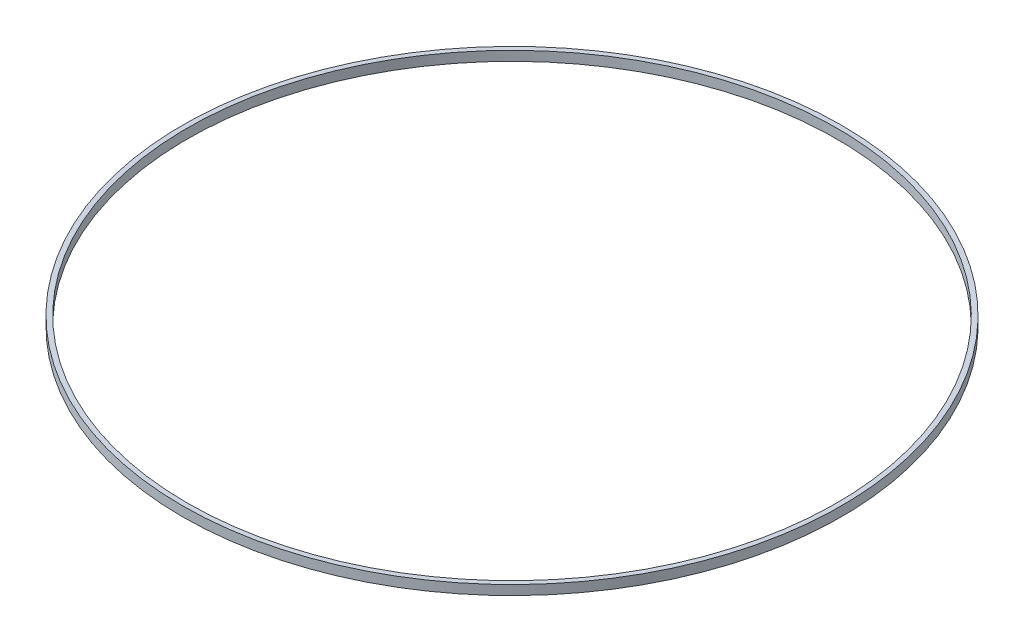
ISO-10303-21;
HEADER;
FILE_DESCRIPTION(('STEP AP214'),'2;1');
FILE_NAME('part.step','',(''),(''),'','','');
FILE_SCHEMA(('AUTOMOTIVE_DESIGN { 1 0 10303 214 1 1 1 1 }'));
ENDSEC;
DATA;
#1=APPLICATION_CONTEXT('core data for automotive mechanical design processes');
#2=APPLICATION_PROTOCOL_DEFINITION('international standard','automotive_design',2000,#1);
#3=PRODUCT_CONTEXT('',#1,'mechanical');
#4=PRODUCT('Part','Part','',(#3));
#5=PRODUCT_RELATED_PRODUCT_CATEGORY('part','',(#4));
#6=PRODUCT_DEFINITION_FORMATION('','',#4);
#7=PRODUCT_DEFINITION_CONTEXT('part definition',#1,'design');
#8=PRODUCT_DEFINITION('design','',#6,#7);
#9=PRODUCT_DEFINITION_SHAPE('','',#8);
#10=(LENGTH_UNIT() NAMED_UNIT(*) SI_UNIT(.MILLI.,.METRE.));
#11=(NAMED_UNIT(*) PLANE_ANGLE_UNIT() SI_UNIT($,.RADIAN.));
#12=(NAMED_UNIT(*) SI_UNIT($,.STERADIAN.) SOLID_ANGLE_UNIT());
#13=UNCERTAINTY_MEASURE_WITH_UNIT(LENGTH_MEASURE(1.E-05),#10,'distance_accuracy_value','');
#14=(GEOMETRIC_REPRESENTATION_CONTEXT(3) GLOBAL_UNCERTAINTY_ASSIGNED_CONTEXT((#13)) GLOBAL_UNIT_ASSIGNED_CONTEXT((#10,
#11,#12)) REPRESENTATION_CONTEXT('',''));
#15=CARTESIAN_POINT('',(0.,0.,0.));
#16=DIRECTION('',(0.,0.,1.));
#17=DIRECTION('',(1.,0.,0.));
#18=AXIS2_PLACEMENT_3D('',#15,#16,#17);
#19=CARTESIAN_POINT('',(0.,10.,0.));
#20=DIRECTION('',(0.,1.,0.));
#21=DIRECTION('',(0.,0.,1.));
#22=AXIS2_PLACEMENT_3D('',#19,#20,#21);
#23=PLANE('',#22);
#24=CARTESIAN_POINT('',(0.,10.,0.));
#25=DIRECTION('',(0.,1.,0.));
#26=DIRECTION('',(0.,0.,1.));
#27=AXIS2_PLACEMENT_3D('',#24,#25,#26);
#28=CIRCLE('',#27,345.);
#29=CARTESIAN_POINT('',(0.,10.,345.));
#30=VERTEX_POINT('',#29);
#31=EDGE_CURVE('E10',#30,#30,#28,.T.);
#32=ORIENTED_EDGE('',*,*,#31,.T.);
#33=EDGE_LOOP('',(#32));
#34=FACE_BOUND('',#33,.T.);
#35=CARTESIAN_POINT('',(0.,10.,0.));
#36=DIRECTION('',(0.,1.,0.));
#37=DIRECTION('',(0.,0.,1.));
#38=AXIS2_PLACEMENT_3D('',#35,#36,#37);
#39=CIRCLE('',#38,340.);
#40=CARTESIAN_POINT('',(0.,10.,340.));
#41=VERTEX_POINT('',#40);
#42=EDGE_CURVE('E56',#41,#41,#39,.T.);
#43=ORIENTED_EDGE('',*,*,#42,.F.);
#44=EDGE_LOOP('',(#43));
#45=FACE_BOUND('',#44,.T.);
#46=ADVANCED_FACE('F43',(#34,#45),#23,.T.);
#47=CARTESIAN_POINT('',(0.,0.,0.));
#48=DIRECTION('',(0.,1.,0.));
#49=DIRECTION('',(0.,0.,1.));
#50=AXIS2_PLACEMENT_3D('',#47,#48,#49);
#51=PLANE('',#50);
#52=CARTESIAN_POINT('',(0.,0.,0.));
#53=DIRECTION('',(0.,1.,0.));
#54=DIRECTION('',(0.,0.,1.));
#55=AXIS2_PLACEMENT_3D('',#52,#53,#54);
#56=CIRCLE('',#55,345.);
#57=CARTESIAN_POINT('',(0.,0.,345.));
#58=VERTEX_POINT('',#57);
#59=EDGE_CURVE('E47',#58,#58,#56,.T.);
#60=ORIENTED_EDGE('',*,*,#59,.F.);
#61=EDGE_LOOP('',(#60));
#62=FACE_BOUND('',#61,.T.);
#63=CARTESIAN_POINT('',(0.,0.,0.));
#64=DIRECTION('',(0.,1.,0.));
#65=DIRECTION('',(0.,0.,1.));
#66=AXIS2_PLACEMENT_3D('',#63,#64,#65);
#67=CIRCLE('',#66,340.);
#68=CARTESIAN_POINT('',(0.,0.,340.));
#69=VERTEX_POINT('',#68);
#70=EDGE_CURVE('E58',#69,#69,#67,.T.);
#71=ORIENTED_EDGE('',*,*,#70,.T.);
#72=EDGE_LOOP('',(#71));
#73=FACE_BOUND('',#72,.T.);
#74=ADVANCED_FACE('F70',(#62,#73),#51,.F.);
#75=CARTESIAN_POINT('',(0.,10.,0.));
#76=DIRECTION('',(0.,-1.,0.));
#77=DIRECTION('',(0.,0.,-1.));
#78=AXIS2_PLACEMENT_3D('',#75,#76,#77);
#79=CYLINDRICAL_SURFACE('',#78,345.);
#80=ORIENTED_EDGE('',*,*,#31,.F.);
#81=EDGE_LOOP('',(#80));
#82=FACE_BOUND('',#81,.T.);
#83=ORIENTED_EDGE('',*,*,#59,.T.);
#84=EDGE_LOOP('',(#83));
#85=FACE_BOUND('',#84,.T.);
#86=ADVANCED_FACE('F45',(#82,#85),#79,.T.);
#87=CARTESIAN_POINT('',(0.,10.,0.));
#88=DIRECTION('',(0.,-1.,0.));
#89=DIRECTION('',(0.,0.,-1.));
#90=AXIS2_PLACEMENT_3D('',#87,#88,#89);
#91=CYLINDRICAL_SURFACE('',#90,340.);
#92=ORIENTED_EDGE('',*,*,#42,.T.);
#93=EDGE_LOOP('',(#92));
#94=FACE_BOUND('',#93,.T.);
#95=ORIENTED_EDGE('',*,*,#70,.F.);
#96=EDGE_LOOP('',(#95));
#97=FACE_BOUND('',#96,.T.);
#98=ADVANCED_FACE('F66',(#94,#97),#91,.F.);
#99=CLOSED_SHELL('',(#46,#74,#86,#98));
#100=MANIFOLD_SOLID_BREP('B2',#99);
#101=ADVANCED_BREP_SHAPE_REPRESENTATION('',(#18,#100),#14);
#102=SHAPE_DEFINITION_REPRESENTATION(#9,#101);
ENDSEC;
END-ISO-10303-21;
